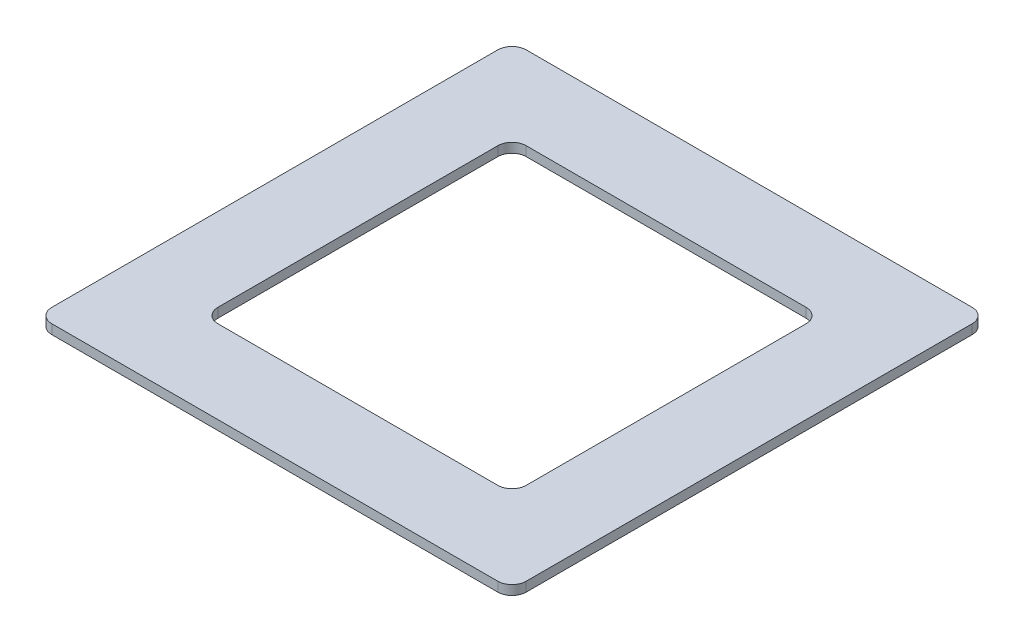
ISO-10303-21;
HEADER;
FILE_DESCRIPTION(('STEP AP214'),'2;1');
FILE_NAME('part.step','',(''),(''),'','','');
FILE_SCHEMA(('AUTOMOTIVE_DESIGN { 1 0 10303 214 1 1 1 1 }'));
ENDSEC;
DATA;
#1=APPLICATION_CONTEXT('core data for automotive mechanical design processes');
#2=APPLICATION_PROTOCOL_DEFINITION('international standard','automotive_design',2000,#1);
#3=PRODUCT_CONTEXT('',#1,'mechanical');
#4=PRODUCT('Part','Part','',(#3));
#5=PRODUCT_RELATED_PRODUCT_CATEGORY('part','',(#4));
#6=PRODUCT_DEFINITION_FORMATION('','',#4);
#7=PRODUCT_DEFINITION_CONTEXT('part definition',#1,'design');
#8=PRODUCT_DEFINITION('design','',#6,#7);
#9=PRODUCT_DEFINITION_SHAPE('','',#8);
#10=(LENGTH_UNIT() NAMED_UNIT(*) SI_UNIT(.MILLI.,.METRE.));
#11=(NAMED_UNIT(*) PLANE_ANGLE_UNIT() SI_UNIT($,.RADIAN.));
#12=(NAMED_UNIT(*) SI_UNIT($,.STERADIAN.) SOLID_ANGLE_UNIT());
#13=UNCERTAINTY_MEASURE_WITH_UNIT(LENGTH_MEASURE(1.E-05),#10,'distance_accuracy_value','');
#14=(GEOMETRIC_REPRESENTATION_CONTEXT(3) GLOBAL_UNCERTAINTY_ASSIGNED_CONTEXT((#13)) GLOBAL_UNIT_ASSIGNED_CONTEXT((#10,
#11,#12)) REPRESENTATION_CONTEXT('',''));
#15=CARTESIAN_POINT('',(0.,0.,0.));
#16=DIRECTION('',(0.,0.,1.));
#17=DIRECTION('',(1.,0.,0.));
#18=AXIS2_PLACEMENT_3D('',#15,#16,#17);
#19=CARTESIAN_POINT('',(3.,2.,3.));
#20=DIRECTION('',(0.,-1.,0.));
#21=DIRECTION('',(0.,0.,-1.));
#22=AXIS2_PLACEMENT_3D('',#19,#20,#21);
#23=PLANE('',#22);
#24=CARTESIAN_POINT('',(3.,2.,3.));
#25=DIRECTION('',(0.,1.,0.));
#26=DIRECTION('',(0.,0.,-1.));
#27=AXIS2_PLACEMENT_3D('',#24,#25,#26);
#28=CIRCLE('',#27,3.);
#29=CARTESIAN_POINT('',(3.,2.,0.));
#30=VERTEX_POINT('',#29);
#31=CARTESIAN_POINT('',(0.,2.,3.));
#32=VERTEX_POINT('',#31);
#33=EDGE_CURVE('E212',#30,#32,#28,.T.);
#34=ORIENTED_EDGE('',*,*,#33,.T.);
#35=DIRECTION('',(0.,0.,1.));
#36=VECTOR('',#35,1.);
#37=CARTESIAN_POINT('',(0.,2.,3.));
#38=LINE('',#37,#36);
#39=CARTESIAN_POINT('',(0.,2.,97.));
#40=VERTEX_POINT('',#39);
#41=EDGE_CURVE('E215',#32,#40,#38,.T.);
#42=ORIENTED_EDGE('',*,*,#41,.T.);
#43=CARTESIAN_POINT('',(3.00000000000001,2.,97.));
#44=DIRECTION('',(0.,1.,0.));
#45=DIRECTION('',(0.,0.,1.));
#46=AXIS2_PLACEMENT_3D('',#43,#44,#45);
#47=CIRCLE('',#46,3.);
#48=CARTESIAN_POINT('',(3.00000000000001,2.,100.));
#49=VERTEX_POINT('',#48);
#50=EDGE_CURVE('E218',#40,#49,#47,.T.);
#51=ORIENTED_EDGE('',*,*,#50,.T.);
#52=DIRECTION('',(1.,0.,0.));
#53=VECTOR('',#52,1.);
#54=CARTESIAN_POINT('',(3.00000000000001,2.,100.));
#55=LINE('',#54,#53);
#56=CARTESIAN_POINT('',(97.,2.,100.));
#57=VERTEX_POINT('',#56);
#58=EDGE_CURVE('E220',#49,#57,#55,.T.);
#59=ORIENTED_EDGE('',*,*,#58,.T.);
#60=CARTESIAN_POINT('',(97.,2.,97.));
#61=DIRECTION('',(0.,1.,0.));
#62=DIRECTION('',(0.,0.,1.));
#63=AXIS2_PLACEMENT_3D('',#60,#61,#62);
#64=CIRCLE('',#63,3.00000000000001);
#65=CARTESIAN_POINT('',(100.,2.,97.));
#66=VERTEX_POINT('',#65);
#67=EDGE_CURVE('E222',#57,#66,#64,.T.);
#68=ORIENTED_EDGE('',*,*,#67,.T.);
#69=DIRECTION('',(0.,0.,-1.));
#70=VECTOR('',#69,1.);
#71=CARTESIAN_POINT('',(100.,2.,3.));
#72=LINE('',#71,#70);
#73=CARTESIAN_POINT('',(100.,2.,3.));
#74=VERTEX_POINT('',#73);
#75=EDGE_CURVE('E224',#66,#74,#72,.T.);
#76=ORIENTED_EDGE('',*,*,#75,.T.);
#77=CARTESIAN_POINT('',(97.,2.,3.));
#78=DIRECTION('',(0.,1.,0.));
#79=DIRECTION('',(0.,0.,-1.));
#80=AXIS2_PLACEMENT_3D('',#77,#78,#79);
#81=CIRCLE('',#80,3.);
#82=CARTESIAN_POINT('',(97.,2.,0.));
#83=VERTEX_POINT('',#82);
#84=EDGE_CURVE('E226',#74,#83,#81,.T.);
#85=ORIENTED_EDGE('',*,*,#84,.T.);
#86=DIRECTION('',(-1.,0.,0.));
#87=VECTOR('',#86,1.);
#88=CARTESIAN_POINT('',(3.,2.,0.));
#89=LINE('',#88,#87);
#90=EDGE_CURVE('E228',#83,#30,#89,.T.);
#91=ORIENTED_EDGE('',*,*,#90,.T.);
#92=EDGE_LOOP('',(#34,#42,#51,#59,#68,#76,#85,#91));
#93=FACE_BOUND('',#92,.T.);
#94=CARTESIAN_POINT('',(20.5,2.,79.5));
#95=DIRECTION('',(0.,1.,0.));
#96=DIRECTION('',(0.,0.,1.));
#97=AXIS2_PLACEMENT_3D('',#94,#95,#96);
#98=CIRCLE('',#97,3.);
#99=CARTESIAN_POINT('',(17.5,2.,79.5));
#100=VERTEX_POINT('',#99);
#101=CARTESIAN_POINT('',(20.5,2.,82.5));
#102=VERTEX_POINT('',#101);
#103=EDGE_CURVE('E147',#100,#102,#98,.T.);
#104=ORIENTED_EDGE('',*,*,#103,.F.);
#105=DIRECTION('',(0.,0.,1.));
#106=VECTOR('',#105,1.);
#107=CARTESIAN_POINT('',(17.5,2.,20.5));
#108=LINE('',#107,#106);
#109=CARTESIAN_POINT('',(17.5,2.,20.5));
#110=VERTEX_POINT('',#109);
#111=EDGE_CURVE('E180',#110,#100,#108,.T.);
#112=ORIENTED_EDGE('',*,*,#111,.F.);
#113=CARTESIAN_POINT('',(20.5,2.,20.5));
#114=DIRECTION('',(0.,1.,0.));
#115=DIRECTION('',(0.,0.,1.));
#116=AXIS2_PLACEMENT_3D('',#113,#114,#115);
#117=CIRCLE('',#116,3.);
#118=CARTESIAN_POINT('',(20.5,2.,17.5));
#119=VERTEX_POINT('',#118);
#120=EDGE_CURVE('E178',#119,#110,#117,.T.);
#121=ORIENTED_EDGE('',*,*,#120,.F.);
#122=DIRECTION('',(-1.,0.,0.));
#123=VECTOR('',#122,1.);
#124=CARTESIAN_POINT('',(20.5,2.,17.5));
#125=LINE('',#124,#123);
#126=CARTESIAN_POINT('',(79.5,2.,17.5));
#127=VERTEX_POINT('',#126);
#128=EDGE_CURVE('E176',#127,#119,#125,.T.);
#129=ORIENTED_EDGE('',*,*,#128,.F.);
#130=CARTESIAN_POINT('',(79.5,2.,20.5));
#131=DIRECTION('',(0.,1.,0.));
#132=DIRECTION('',(0.,0.,-1.));
#133=AXIS2_PLACEMENT_3D('',#130,#131,#132);
#134=CIRCLE('',#133,3.);
#135=CARTESIAN_POINT('',(82.5,2.,20.5));
#136=VERTEX_POINT('',#135);
#137=EDGE_CURVE('E174',#136,#127,#134,.T.);
#138=ORIENTED_EDGE('',*,*,#137,.F.);
#139=DIRECTION('',(0.,0.,-1.));
#140=VECTOR('',#139,1.);
#141=CARTESIAN_POINT('',(82.5,2.,20.5));
#142=LINE('',#141,#140);
#143=CARTESIAN_POINT('',(82.5,2.,79.5));
#144=VERTEX_POINT('',#143);
#145=EDGE_CURVE('E170',#144,#136,#142,.T.);
#146=ORIENTED_EDGE('',*,*,#145,.F.);
#147=CARTESIAN_POINT('',(79.5,2.,79.5));
#148=DIRECTION('',(0.,1.,0.));
#149=DIRECTION('',(0.,0.,-1.));
#150=AXIS2_PLACEMENT_3D('',#147,#148,#149);
#151=CIRCLE('',#150,3.);
#152=CARTESIAN_POINT('',(79.5,2.,82.5));
#153=VERTEX_POINT('',#152);
#154=EDGE_CURVE('E168',#153,#144,#151,.T.);
#155=ORIENTED_EDGE('',*,*,#154,.F.);
#156=DIRECTION('',(1.,0.,0.));
#157=VECTOR('',#156,1.);
#158=CARTESIAN_POINT('',(20.5,2.,82.5));
#159=LINE('',#158,#157);
#160=EDGE_CURVE('E155',#102,#153,#159,.T.);
#161=ORIENTED_EDGE('',*,*,#160,.F.);
#162=EDGE_LOOP('',(#104,#112,#121,#129,#138,#146,#155,#161));
#163=FACE_BOUND('',#162,.T.);
#164=ADVANCED_FACE('F34',(#93,#163),#23,.F.);
#165=CARTESIAN_POINT('',(3.,0.,3.));
#166=DIRECTION('',(0.,-1.,0.));
#167=DIRECTION('',(0.,0.,-1.));
#168=AXIS2_PLACEMENT_3D('',#165,#166,#167);
#169=PLANE('',#168);
#170=CARTESIAN_POINT('',(3.,0.,3.));
#171=DIRECTION('',(0.,1.,0.));
#172=DIRECTION('',(0.,0.,-1.));
#173=AXIS2_PLACEMENT_3D('',#170,#171,#172);
#174=CIRCLE('',#173,3.);
#175=CARTESIAN_POINT('',(3.,0.,0.));
#176=VERTEX_POINT('',#175);
#177=CARTESIAN_POINT('',(0.,0.,3.));
#178=VERTEX_POINT('',#177);
#179=EDGE_CURVE('E163',#176,#178,#174,.T.);
#180=ORIENTED_EDGE('',*,*,#179,.F.);
#181=DIRECTION('',(-1.,0.,0.));
#182=VECTOR('',#181,1.);
#183=CARTESIAN_POINT('',(3.,0.,0.));
#184=LINE('',#183,#182);
#185=CARTESIAN_POINT('',(97.,0.,0.));
#186=VERTEX_POINT('',#185);
#187=EDGE_CURVE('E216',#186,#176,#184,.T.);
#188=ORIENTED_EDGE('',*,*,#187,.F.);
#189=CARTESIAN_POINT('',(97.,0.,3.));
#190=DIRECTION('',(0.,1.,0.));
#191=DIRECTION('',(0.,0.,-1.));
#192=AXIS2_PLACEMENT_3D('',#189,#190,#191);
#193=CIRCLE('',#192,3.);
#194=CARTESIAN_POINT('',(100.,0.,3.));
#195=VERTEX_POINT('',#194);
#196=EDGE_CURVE('E243',#195,#186,#193,.T.);
#197=ORIENTED_EDGE('',*,*,#196,.F.);
#198=DIRECTION('',(0.,0.,-1.));
#199=VECTOR('',#198,1.);
#200=CARTESIAN_POINT('',(100.,0.,3.));
#201=LINE('',#200,#199);
#202=CARTESIAN_POINT('',(100.,0.,97.));
#203=VERTEX_POINT('',#202);
#204=EDGE_CURVE('E241',#203,#195,#201,.T.);
#205=ORIENTED_EDGE('',*,*,#204,.F.);
#206=CARTESIAN_POINT('',(97.,0.,97.));
#207=DIRECTION('',(0.,1.,0.));
#208=DIRECTION('',(0.,0.,1.));
#209=AXIS2_PLACEMENT_3D('',#206,#207,#208);
#210=CIRCLE('',#209,3.00000000000001);
#211=CARTESIAN_POINT('',(97.,0.,100.));
#212=VERTEX_POINT('',#211);
#213=EDGE_CURVE('E239',#212,#203,#210,.T.);
#214=ORIENTED_EDGE('',*,*,#213,.F.);
#215=DIRECTION('',(1.,0.,0.));
#216=VECTOR('',#215,1.);
#217=CARTESIAN_POINT('',(3.00000000000001,0.,100.));
#218=LINE('',#217,#216);
#219=CARTESIAN_POINT('',(3.00000000000001,0.,100.));
#220=VERTEX_POINT('',#219);
#221=EDGE_CURVE('E237',#220,#212,#218,.T.);
#222=ORIENTED_EDGE('',*,*,#221,.F.);
#223=CARTESIAN_POINT('',(3.00000000000001,0.,97.));
#224=DIRECTION('',(0.,1.,0.));
#225=DIRECTION('',(0.,0.,1.));
#226=AXIS2_PLACEMENT_3D('',#223,#224,#225);
#227=CIRCLE('',#226,3.);
#228=CARTESIAN_POINT('',(0.,0.,97.));
#229=VERTEX_POINT('',#228);
#230=EDGE_CURVE('E235',#229,#220,#227,.T.);
#231=ORIENTED_EDGE('',*,*,#230,.F.);
#232=DIRECTION('',(0.,0.,1.));
#233=VECTOR('',#232,1.);
#234=CARTESIAN_POINT('',(0.,0.,3.));
#235=LINE('',#234,#233);
#236=EDGE_CURVE('E233',#178,#229,#235,.T.);
#237=ORIENTED_EDGE('',*,*,#236,.F.);
#238=EDGE_LOOP('',(#180,#188,#197,#205,#214,#222,#231,#237));
#239=FACE_BOUND('',#238,.T.);
#240=DIRECTION('',(0.,0.,1.));
#241=VECTOR('',#240,1.);
#242=CARTESIAN_POINT('',(17.5,0.,20.5));
#243=LINE('',#242,#241);
#244=CARTESIAN_POINT('',(17.5,0.,20.5));
#245=VERTEX_POINT('',#244);
#246=CARTESIAN_POINT('',(17.5,0.,79.5));
#247=VERTEX_POINT('',#246);
#248=EDGE_CURVE('E156',#245,#247,#243,.T.);
#249=ORIENTED_EDGE('',*,*,#248,.T.);
#250=CARTESIAN_POINT('',(20.5,0.,79.5));
#251=DIRECTION('',(0.,1.,0.));
#252=DIRECTION('',(0.,0.,1.));
#253=AXIS2_PLACEMENT_3D('',#250,#251,#252);
#254=CIRCLE('',#253,3.);
#255=CARTESIAN_POINT('',(20.5,0.,82.5));
#256=VERTEX_POINT('',#255);
#257=EDGE_CURVE('E57',#247,#256,#254,.T.);
#258=ORIENTED_EDGE('',*,*,#257,.T.);
#259=DIRECTION('',(1.,0.,0.));
#260=VECTOR('',#259,1.);
#261=CARTESIAN_POINT('',(20.5,0.,82.5));
#262=LINE('',#261,#260);
#263=CARTESIAN_POINT('',(79.5,0.,82.5));
#264=VERTEX_POINT('',#263);
#265=EDGE_CURVE('E162',#256,#264,#262,.T.);
#266=ORIENTED_EDGE('',*,*,#265,.T.);
#267=CARTESIAN_POINT('',(79.5,0.,79.5));
#268=DIRECTION('',(0.,1.,0.));
#269=DIRECTION('',(0.,0.,-1.));
#270=AXIS2_PLACEMENT_3D('',#267,#268,#269);
#271=CIRCLE('',#270,3.);
#272=CARTESIAN_POINT('',(82.5,0.,79.5));
#273=VERTEX_POINT('',#272);
#274=EDGE_CURVE('E184',#264,#273,#271,.T.);
#275=ORIENTED_EDGE('',*,*,#274,.T.);
#276=DIRECTION('',(0.,0.,-1.));
#277=VECTOR('',#276,1.);
#278=CARTESIAN_POINT('',(82.5,0.,20.5));
#279=LINE('',#278,#277);
#280=CARTESIAN_POINT('',(82.5,0.,20.5));
#281=VERTEX_POINT('',#280);
#282=EDGE_CURVE('E187',#273,#281,#279,.T.);
#283=ORIENTED_EDGE('',*,*,#282,.T.);
#284=CARTESIAN_POINT('',(79.5,0.,20.5));
#285=DIRECTION('',(0.,1.,0.));
#286=DIRECTION('',(0.,0.,-1.));
#287=AXIS2_PLACEMENT_3D('',#284,#285,#286);
#288=CIRCLE('',#287,3.);
#289=CARTESIAN_POINT('',(79.5,0.,17.5));
#290=VERTEX_POINT('',#289);
#291=EDGE_CURVE('E190',#281,#290,#288,.T.);
#292=ORIENTED_EDGE('',*,*,#291,.T.);
#293=DIRECTION('',(-1.,0.,0.));
#294=VECTOR('',#293,1.);
#295=CARTESIAN_POINT('',(20.5,0.,17.5));
#296=LINE('',#295,#294);
#297=CARTESIAN_POINT('',(20.5,0.,17.5));
#298=VERTEX_POINT('',#297);
#299=EDGE_CURVE('E193',#290,#298,#296,.T.);
#300=ORIENTED_EDGE('',*,*,#299,.T.);
#301=CARTESIAN_POINT('',(20.5,0.,20.5));
#302=DIRECTION('',(0.,1.,0.));
#303=DIRECTION('',(0.,0.,1.));
#304=AXIS2_PLACEMENT_3D('',#301,#302,#303);
#305=CIRCLE('',#304,3.);
#306=EDGE_CURVE('E196',#298,#245,#305,.T.);
#307=ORIENTED_EDGE('',*,*,#306,.T.);
#308=EDGE_LOOP('',(#249,#258,#266,#275,#283,#292,#300,#307));
#309=FACE_BOUND('',#308,.T.);
#310=ADVANCED_FACE('F273',(#239,#309),#169,.T.);
#311=CARTESIAN_POINT('',(3.,2.,3.));
#312=DIRECTION('',(0.,-1.,0.));
#313=DIRECTION('',(0.,0.,-1.));
#314=AXIS2_PLACEMENT_3D('',#311,#312,#313);
#315=CYLINDRICAL_SURFACE('',#314,3.);
#316=ORIENTED_EDGE('',*,*,#179,.T.);
#317=DIRECTION('',(0.,-1.,0.));
#318=VECTOR('',#317,1.);
#319=CARTESIAN_POINT('',(0.,2.,3.));
#320=LINE('',#319,#318);
#321=EDGE_CURVE('E11',#32,#178,#320,.T.);
#322=ORIENTED_EDGE('',*,*,#321,.F.);
#323=ORIENTED_EDGE('',*,*,#33,.F.);
#324=DIRECTION('',(0.,-1.,0.));
#325=VECTOR('',#324,1.);
#326=CARTESIAN_POINT('',(3.,2.,0.));
#327=LINE('',#326,#325);
#328=EDGE_CURVE('E230',#30,#176,#327,.T.);
#329=ORIENTED_EDGE('',*,*,#328,.T.);
#330=EDGE_LOOP('',(#316,#322,#323,#329));
#331=FACE_BOUND('',#330,.T.);
#332=ADVANCED_FACE('F36',(#331),#315,.T.);
#333=CARTESIAN_POINT('',(0.,2.,3.));
#334=DIRECTION('',(1.,0.,0.));
#335=DIRECTION('',(0.,0.,-1.));
#336=AXIS2_PLACEMENT_3D('',#333,#334,#335);
#337=PLANE('',#336);
#338=ORIENTED_EDGE('',*,*,#236,.T.);
#339=DIRECTION('',(0.,-1.,0.));
#340=VECTOR('',#339,1.);
#341=CARTESIAN_POINT('',(0.,2.,97.));
#342=LINE('',#341,#340);
#343=EDGE_CURVE('E42',#40,#229,#342,.T.);
#344=ORIENTED_EDGE('',*,*,#343,.F.);
#345=ORIENTED_EDGE('',*,*,#41,.F.);
#346=ORIENTED_EDGE('',*,*,#321,.T.);
#347=EDGE_LOOP('',(#338,#344,#345,#346));
#348=FACE_BOUND('',#347,.T.);
#349=ADVANCED_FACE('F290',(#348),#337,.F.);
#350=CARTESIAN_POINT('',(3.00000000000001,2.,97.));
#351=DIRECTION('',(0.,-1.,0.));
#352=DIRECTION('',(0.,0.,-1.));
#353=AXIS2_PLACEMENT_3D('',#350,#351,#352);
#354=CYLINDRICAL_SURFACE('',#353,3.);
#355=ORIENTED_EDGE('',*,*,#230,.T.);
#356=DIRECTION('',(0.,-1.,0.));
#357=VECTOR('',#356,1.);
#358=CARTESIAN_POINT('',(3.00000000000001,2.,100.));
#359=LINE('',#358,#357);
#360=EDGE_CURVE('E260',#49,#220,#359,.T.);
#361=ORIENTED_EDGE('',*,*,#360,.F.);
#362=ORIENTED_EDGE('',*,*,#50,.F.);
#363=ORIENTED_EDGE('',*,*,#343,.T.);
#364=EDGE_LOOP('',(#355,#361,#362,#363));
#365=FACE_BOUND('',#364,.T.);
#366=ADVANCED_FACE('F267',(#365),#354,.T.);
#367=CARTESIAN_POINT('',(3.00000000000001,2.,100.));
#368=DIRECTION('',(0.,0.,-1.));
#369=DIRECTION('',(-1.,0.,0.));
#370=AXIS2_PLACEMENT_3D('',#367,#368,#369);
#371=PLANE('',#370);
#372=ORIENTED_EDGE('',*,*,#221,.T.);
#373=DIRECTION('',(0.,-1.,0.));
#374=VECTOR('',#373,1.);
#375=CARTESIAN_POINT('',(97.,2.,100.));
#376=LINE('',#375,#374);
#377=EDGE_CURVE('E257',#57,#212,#376,.T.);
#378=ORIENTED_EDGE('',*,*,#377,.F.);
#379=ORIENTED_EDGE('',*,*,#58,.F.);
#380=ORIENTED_EDGE('',*,*,#360,.T.);
#381=EDGE_LOOP('',(#372,#378,#379,#380));
#382=FACE_BOUND('',#381,.T.);
#383=ADVANCED_FACE('F279',(#382),#371,.F.);
#384=CARTESIAN_POINT('',(97.,2.,97.));
#385=DIRECTION('',(0.,-1.,0.));
#386=DIRECTION('',(0.,0.,-1.));
#387=AXIS2_PLACEMENT_3D('',#384,#385,#386);
#388=CYLINDRICAL_SURFACE('',#387,3.00000000000001);
#389=ORIENTED_EDGE('',*,*,#213,.T.);
#390=DIRECTION('',(0.,-1.,0.));
#391=VECTOR('',#390,1.);
#392=CARTESIAN_POINT('',(100.,2.,97.));
#393=LINE('',#392,#391);
#394=EDGE_CURVE('E254',#66,#203,#393,.T.);
#395=ORIENTED_EDGE('',*,*,#394,.F.);
#396=ORIENTED_EDGE('',*,*,#67,.F.);
#397=ORIENTED_EDGE('',*,*,#377,.T.);
#398=EDGE_LOOP('',(#389,#395,#396,#397));
#399=FACE_BOUND('',#398,.T.);
#400=ADVANCED_FACE('F283',(#399),#388,.T.);
#401=CARTESIAN_POINT('',(100.,2.,3.));
#402=DIRECTION('',(-1.,0.,0.));
#403=DIRECTION('',(0.,0.,1.));
#404=AXIS2_PLACEMENT_3D('',#401,#402,#403);
#405=PLANE('',#404);
#406=ORIENTED_EDGE('',*,*,#204,.T.);
#407=DIRECTION('',(0.,-1.,0.));
#408=VECTOR('',#407,1.);
#409=CARTESIAN_POINT('',(100.,2.,3.));
#410=LINE('',#409,#408);
#411=EDGE_CURVE('E251',#74,#195,#410,.T.);
#412=ORIENTED_EDGE('',*,*,#411,.F.);
#413=ORIENTED_EDGE('',*,*,#75,.F.);
#414=ORIENTED_EDGE('',*,*,#394,.T.);
#415=EDGE_LOOP('',(#406,#412,#413,#414));
#416=FACE_BOUND('',#415,.T.);
#417=ADVANCED_FACE('F303',(#416),#405,.F.);
#418=CARTESIAN_POINT('',(97.,2.,3.));
#419=DIRECTION('',(0.,-1.,0.));
#420=DIRECTION('',(0.,0.,-1.));
#421=AXIS2_PLACEMENT_3D('',#418,#419,#420);
#422=CYLINDRICAL_SURFACE('',#421,3.);
#423=ORIENTED_EDGE('',*,*,#196,.T.);
#424=DIRECTION('',(0.,-1.,0.));
#425=VECTOR('',#424,1.);
#426=CARTESIAN_POINT('',(97.,2.,0.));
#427=LINE('',#426,#425);
#428=EDGE_CURVE('E248',#83,#186,#427,.T.);
#429=ORIENTED_EDGE('',*,*,#428,.F.);
#430=ORIENTED_EDGE('',*,*,#84,.F.);
#431=ORIENTED_EDGE('',*,*,#411,.T.);
#432=EDGE_LOOP('',(#423,#429,#430,#431));
#433=FACE_BOUND('',#432,.T.);
#434=ADVANCED_FACE('F301',(#433),#422,.T.);
#435=CARTESIAN_POINT('',(3.,2.,0.));
#436=DIRECTION('',(0.,0.,1.));
#437=DIRECTION('',(1.,0.,0.));
#438=AXIS2_PLACEMENT_3D('',#435,#436,#437);
#439=PLANE('',#438);
#440=ORIENTED_EDGE('',*,*,#187,.T.);
#441=ORIENTED_EDGE('',*,*,#328,.F.);
#442=ORIENTED_EDGE('',*,*,#90,.F.);
#443=ORIENTED_EDGE('',*,*,#428,.T.);
#444=EDGE_LOOP('',(#440,#441,#442,#443));
#445=FACE_BOUND('',#444,.T.);
#446=ADVANCED_FACE('F296',(#445),#439,.F.);
#447=CARTESIAN_POINT('',(20.5,2.,79.5));
#448=DIRECTION('',(0.,-1.,0.));
#449=DIRECTION('',(0.,0.,-1.));
#450=AXIS2_PLACEMENT_3D('',#447,#448,#449);
#451=CYLINDRICAL_SURFACE('',#450,3.);
#452=ORIENTED_EDGE('',*,*,#257,.F.);
#453=DIRECTION('',(0.,-1.,0.));
#454=VECTOR('',#453,1.);
#455=CARTESIAN_POINT('',(17.5,2.,79.5));
#456=LINE('',#455,#454);
#457=EDGE_CURVE('E151',#100,#247,#456,.T.);
#458=ORIENTED_EDGE('',*,*,#457,.F.);
#459=ORIENTED_EDGE('',*,*,#103,.T.);
#460=DIRECTION('',(0.,-1.,0.));
#461=VECTOR('',#460,1.);
#462=CARTESIAN_POINT('',(20.5,2.,82.5));
#463=LINE('',#462,#461);
#464=EDGE_CURVE('E150',#102,#256,#463,.T.);
#465=ORIENTED_EDGE('',*,*,#464,.T.);
#466=EDGE_LOOP('',(#452,#458,#459,#465));
#467=FACE_BOUND('',#466,.T.);
#468=ADVANCED_FACE('F149',(#467),#451,.F.);
#469=CARTESIAN_POINT('',(20.5,2.,82.5));
#470=DIRECTION('',(0.,0.,-1.));
#471=DIRECTION('',(-1.,0.,0.));
#472=AXIS2_PLACEMENT_3D('',#469,#470,#471);
#473=PLANE('',#472);
#474=ORIENTED_EDGE('',*,*,#265,.F.);
#475=ORIENTED_EDGE('',*,*,#464,.F.);
#476=ORIENTED_EDGE('',*,*,#160,.T.);
#477=DIRECTION('',(0.,-1.,0.));
#478=VECTOR('',#477,1.);
#479=CARTESIAN_POINT('',(79.5,2.,82.5));
#480=LINE('',#479,#478);
#481=EDGE_CURVE('E164',#153,#264,#480,.T.);
#482=ORIENTED_EDGE('',*,*,#481,.T.);
#483=EDGE_LOOP('',(#474,#475,#476,#482));
#484=FACE_BOUND('',#483,.T.);
#485=ADVANCED_FACE('F159',(#484),#473,.T.);
#486=CARTESIAN_POINT('',(79.5,2.,79.5));
#487=DIRECTION('',(0.,-1.,0.));
#488=DIRECTION('',(0.,0.,-1.));
#489=AXIS2_PLACEMENT_3D('',#486,#487,#488);
#490=CYLINDRICAL_SURFACE('',#489,3.);
#491=ORIENTED_EDGE('',*,*,#274,.F.);
#492=ORIENTED_EDGE('',*,*,#481,.F.);
#493=ORIENTED_EDGE('',*,*,#154,.T.);
#494=DIRECTION('',(0.,-1.,0.));
#495=VECTOR('',#494,1.);
#496=CARTESIAN_POINT('',(82.5,2.,79.5));
#497=LINE('',#496,#495);
#498=EDGE_CURVE('E209',#144,#273,#497,.T.);
#499=ORIENTED_EDGE('',*,*,#498,.T.);
#500=EDGE_LOOP('',(#491,#492,#493,#499));
#501=FACE_BOUND('',#500,.T.);
#502=ADVANCED_FACE('F328',(#501),#490,.F.);
#503=CARTESIAN_POINT('',(82.5,2.,20.5));
#504=DIRECTION('',(-1.,0.,0.));
#505=DIRECTION('',(0.,0.,1.));
#506=AXIS2_PLACEMENT_3D('',#503,#504,#505);
#507=PLANE('',#506);
#508=ORIENTED_EDGE('',*,*,#282,.F.);
#509=ORIENTED_EDGE('',*,*,#498,.F.);
#510=ORIENTED_EDGE('',*,*,#145,.T.);
#511=DIRECTION('',(0.,-1.,0.));
#512=VECTOR('',#511,1.);
#513=CARTESIAN_POINT('',(82.5,2.,20.5));
#514=LINE('',#513,#512);
#515=EDGE_CURVE('E207',#136,#281,#514,.T.);
#516=ORIENTED_EDGE('',*,*,#515,.T.);
#517=EDGE_LOOP('',(#508,#509,#510,#516));
#518=FACE_BOUND('',#517,.T.);
#519=ADVANCED_FACE('F332',(#518),#507,.T.);
#520=CARTESIAN_POINT('',(79.5,2.,20.5));
#521=DIRECTION('',(0.,-1.,0.));
#522=DIRECTION('',(0.,0.,-1.));
#523=AXIS2_PLACEMENT_3D('',#520,#521,#522);
#524=CYLINDRICAL_SURFACE('',#523,3.);
#525=ORIENTED_EDGE('',*,*,#291,.F.);
#526=ORIENTED_EDGE('',*,*,#515,.F.);
#527=ORIENTED_EDGE('',*,*,#137,.T.);
#528=DIRECTION('',(0.,-1.,0.));
#529=VECTOR('',#528,1.);
#530=CARTESIAN_POINT('',(79.5,2.,17.5));
#531=LINE('',#530,#529);
#532=EDGE_CURVE('E205',#127,#290,#531,.T.);
#533=ORIENTED_EDGE('',*,*,#532,.T.);
#534=EDGE_LOOP('',(#525,#526,#527,#533));
#535=FACE_BOUND('',#534,.T.);
#536=ADVANCED_FACE('F338',(#535),#524,.F.);
#537=CARTESIAN_POINT('',(20.5,2.,17.5));
#538=DIRECTION('',(0.,0.,1.));
#539=DIRECTION('',(1.,0.,0.));
#540=AXIS2_PLACEMENT_3D('',#537,#538,#539);
#541=PLANE('',#540);
#542=ORIENTED_EDGE('',*,*,#299,.F.);
#543=ORIENTED_EDGE('',*,*,#532,.F.);
#544=ORIENTED_EDGE('',*,*,#128,.T.);
#545=DIRECTION('',(0.,-1.,0.));
#546=VECTOR('',#545,1.);
#547=CARTESIAN_POINT('',(20.5,2.,17.5));
#548=LINE('',#547,#546);
#549=EDGE_CURVE('E203',#119,#298,#548,.T.);
#550=ORIENTED_EDGE('',*,*,#549,.T.);
#551=EDGE_LOOP('',(#542,#543,#544,#550));
#552=FACE_BOUND('',#551,.T.);
#553=ADVANCED_FACE('F342',(#552),#541,.T.);
#554=CARTESIAN_POINT('',(20.5,2.,20.5));
#555=DIRECTION('',(0.,-1.,0.));
#556=DIRECTION('',(0.,0.,-1.));
#557=AXIS2_PLACEMENT_3D('',#554,#555,#556);
#558=CYLINDRICAL_SURFACE('',#557,3.);
#559=ORIENTED_EDGE('',*,*,#306,.F.);
#560=ORIENTED_EDGE('',*,*,#549,.F.);
#561=ORIENTED_EDGE('',*,*,#120,.T.);
#562=DIRECTION('',(0.,-1.,0.));
#563=VECTOR('',#562,1.);
#564=CARTESIAN_POINT('',(17.5,2.,20.5));
#565=LINE('',#564,#563);
#566=EDGE_CURVE('E49',#110,#245,#565,.T.);
#567=ORIENTED_EDGE('',*,*,#566,.T.);
#568=EDGE_LOOP('',(#559,#560,#561,#567));
#569=FACE_BOUND('',#568,.T.);
#570=ADVANCED_FACE('F346',(#569),#558,.F.);
#571=CARTESIAN_POINT('',(17.5,2.,20.5));
#572=DIRECTION('',(1.,0.,0.));
#573=DIRECTION('',(0.,0.,-1.));
#574=AXIS2_PLACEMENT_3D('',#571,#572,#573);
#575=PLANE('',#574);
#576=ORIENTED_EDGE('',*,*,#248,.F.);
#577=ORIENTED_EDGE('',*,*,#566,.F.);
#578=ORIENTED_EDGE('',*,*,#111,.T.);
#579=ORIENTED_EDGE('',*,*,#457,.T.);
#580=EDGE_LOOP('',(#576,#577,#578,#579));
#581=FACE_BOUND('',#580,.T.);
#582=ADVANCED_FACE('F350',(#581),#575,.T.);
#583=CLOSED_SHELL('',(#164,#310,#332,#349,#366,#383,#400,#417,#434,#446,#468,#485,#502,#519,
#536,#553,#570,#582));
#584=MANIFOLD_SOLID_BREP('B2',#583);
#585=ADVANCED_BREP_SHAPE_REPRESENTATION('',(#18,#584),#14);
#586=SHAPE_DEFINITION_REPRESENTATION(#9,#585);
ENDSEC;
END-ISO-10303-21;
